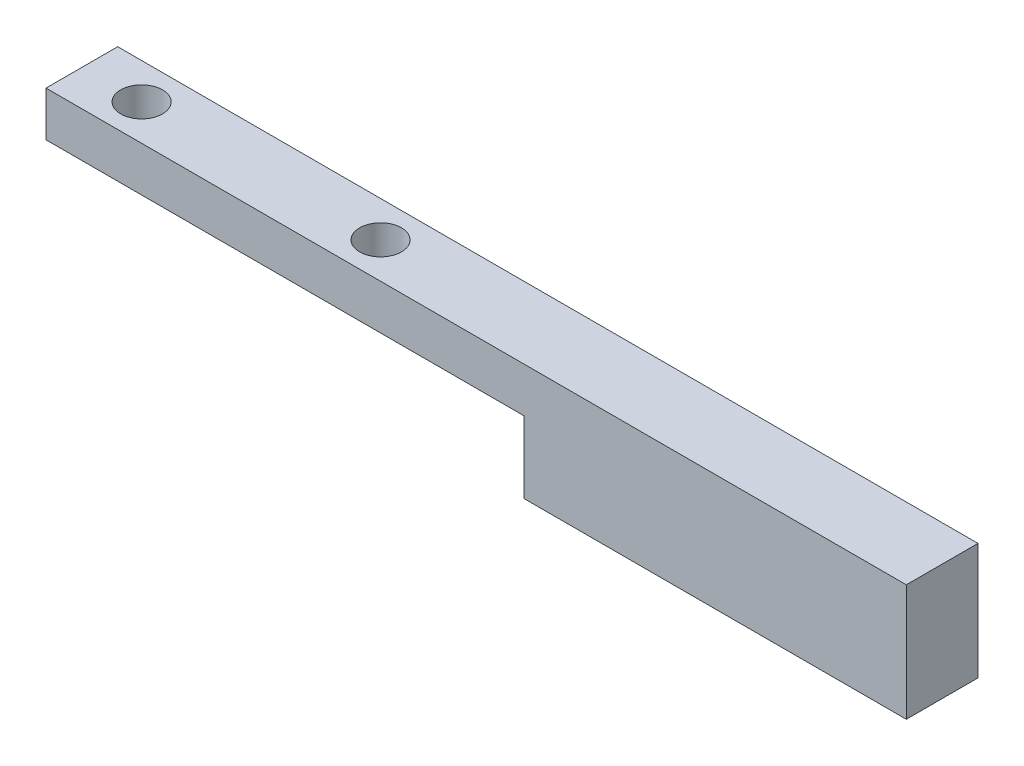
ISO-10303-21;
HEADER;
FILE_DESCRIPTION(('STEP AP214'),'2;1');
FILE_NAME('part.step','',(''),(''),'','','');
FILE_SCHEMA(('AUTOMOTIVE_DESIGN { 1 0 10303 214 1 1 1 1 }'));
ENDSEC;
DATA;
#1=APPLICATION_CONTEXT('core data for automotive mechanical design processes');
#2=APPLICATION_PROTOCOL_DEFINITION('international standard','automotive_design',2000,#1);
#3=PRODUCT_CONTEXT('',#1,'mechanical');
#4=PRODUCT('Part','Part','',(#3));
#5=PRODUCT_RELATED_PRODUCT_CATEGORY('part','',(#4));
#6=PRODUCT_DEFINITION_FORMATION('','',#4);
#7=PRODUCT_DEFINITION_CONTEXT('part definition',#1,'design');
#8=PRODUCT_DEFINITION('design','',#6,#7);
#9=PRODUCT_DEFINITION_SHAPE('','',#8);
#10=(LENGTH_UNIT() NAMED_UNIT(*) SI_UNIT(.MILLI.,.METRE.));
#11=(NAMED_UNIT(*) PLANE_ANGLE_UNIT() SI_UNIT($,.RADIAN.));
#12=(NAMED_UNIT(*) SI_UNIT($,.STERADIAN.) SOLID_ANGLE_UNIT());
#13=UNCERTAINTY_MEASURE_WITH_UNIT(LENGTH_MEASURE(1.E-05),#10,'distance_accuracy_value','');
#14=(GEOMETRIC_REPRESENTATION_CONTEXT(3) GLOBAL_UNCERTAINTY_ASSIGNED_CONTEXT((#13)) GLOBAL_UNIT_ASSIGNED_CONTEXT((#10,
#11,#12)) REPRESENTATION_CONTEXT('',''));
#15=CARTESIAN_POINT('',(0.,0.,0.));
#16=DIRECTION('',(0.,0.,1.));
#17=DIRECTION('',(1.,0.,0.));
#18=AXIS2_PLACEMENT_3D('',#15,#16,#17);
#19=CARTESIAN_POINT('',(0.,3.75,0.));
#20=DIRECTION('',(0.,1.,0.));
#21=DIRECTION('',(0.,0.,1.));
#22=AXIS2_PLACEMENT_3D('',#19,#20,#21);
#23=PLANE('',#22);
#24=CARTESIAN_POINT('',(-15.,3.75,0.));
#25=DIRECTION('',(0.,1.,0.));
#26=DIRECTION('',(0.,0.,1.));
#27=AXIS2_PLACEMENT_3D('',#24,#25,#26);
#28=CIRCLE('',#27,1.75);
#29=CARTESIAN_POINT('',(-15.,3.75,1.75));
#30=VERTEX_POINT('',#29);
#31=EDGE_CURVE('E102',#30,#30,#28,.T.);
#32=ORIENTED_EDGE('',*,*,#31,.F.);
#33=EDGE_LOOP('',(#32));
#34=FACE_BOUND('',#33,.T.);
#35=DIRECTION('',(1.,0.,0.));
#36=VECTOR('',#35,1.);
#37=CARTESIAN_POINT('',(-20.,3.75,3.));
#38=LINE('',#37,#36);
#39=CARTESIAN_POINT('',(-20.,3.75,3.));
#40=VERTEX_POINT('',#39);
#41=CARTESIAN_POINT('',(52.,3.75,3.));
#42=VERTEX_POINT('',#41);
#43=EDGE_CURVE('E147',#40,#42,#38,.T.);
#44=ORIENTED_EDGE('',*,*,#43,.T.);
#45=DIRECTION('',(0.,0.,1.));
#46=VECTOR('',#45,1.);
#47=CARTESIAN_POINT('',(52.,3.75,3.));
#48=LINE('',#47,#46);
#49=CARTESIAN_POINT('',(52.,3.75,-3.));
#50=VERTEX_POINT('',#49);
#51=EDGE_CURVE('E115',#50,#42,#48,.T.);
#52=ORIENTED_EDGE('',*,*,#51,.F.);
#53=DIRECTION('',(-1.,0.,0.));
#54=VECTOR('',#53,1.);
#55=CARTESIAN_POINT('',(-20.,3.75,-3.));
#56=LINE('',#55,#54);
#57=CARTESIAN_POINT('',(-20.,3.75,-3.));
#58=VERTEX_POINT('',#57);
#59=EDGE_CURVE('E90',#50,#58,#56,.T.);
#60=ORIENTED_EDGE('',*,*,#59,.T.);
#61=DIRECTION('',(0.,0.,1.));
#62=VECTOR('',#61,1.);
#63=CARTESIAN_POINT('',(-20.,3.75,-3.));
#64=LINE('',#63,#62);
#65=EDGE_CURVE('E61',#58,#40,#64,.T.);
#66=ORIENTED_EDGE('',*,*,#65,.T.);
#67=EDGE_LOOP('',(#44,#52,#60,#66));
#68=FACE_BOUND('',#67,.T.);
#69=CARTESIAN_POINT('',(5.,3.75,0.));
#70=DIRECTION('',(0.,1.,0.));
#71=DIRECTION('',(0.,0.,1.));
#72=AXIS2_PLACEMENT_3D('',#69,#70,#71);
#73=CIRCLE('',#72,1.75);
#74=CARTESIAN_POINT('',(5.,3.75,1.75));
#75=VERTEX_POINT('',#74);
#76=EDGE_CURVE('E129',#75,#75,#73,.T.);
#77=ORIENTED_EDGE('',*,*,#76,.F.);
#78=EDGE_LOOP('',(#77));
#79=FACE_BOUND('',#78,.T.);
#80=ADVANCED_FACE('F43',(#34,#68,#79),#23,.T.);
#81=CARTESIAN_POINT('',(0.,0.,0.));
#82=DIRECTION('',(0.,1.,0.));
#83=DIRECTION('',(0.,0.,1.));
#84=AXIS2_PLACEMENT_3D('',#81,#82,#83);
#85=PLANE('',#84);
#86=DIRECTION('',(0.,0.,-1.));
#87=VECTOR('',#86,1.);
#88=CARTESIAN_POINT('',(20.,0.,-3.));
#89=LINE('',#88,#87);
#90=CARTESIAN_POINT('',(20.,0.,3.));
#91=VERTEX_POINT('',#90);
#92=CARTESIAN_POINT('',(20.,0.,-3.));
#93=VERTEX_POINT('',#92);
#94=EDGE_CURVE('E94',#91,#93,#89,.T.);
#95=ORIENTED_EDGE('',*,*,#94,.F.);
#96=DIRECTION('',(1.,0.,0.));
#97=VECTOR('',#96,1.);
#98=CARTESIAN_POINT('',(-20.,0.,3.));
#99=LINE('',#98,#97);
#100=CARTESIAN_POINT('',(-20.,0.,3.));
#101=VERTEX_POINT('',#100);
#102=EDGE_CURVE('E79',#101,#91,#99,.T.);
#103=ORIENTED_EDGE('',*,*,#102,.F.);
#104=DIRECTION('',(0.,0.,1.));
#105=VECTOR('',#104,1.);
#106=CARTESIAN_POINT('',(-20.,0.,-3.));
#107=LINE('',#106,#105);
#108=CARTESIAN_POINT('',(-20.,0.,-3.));
#109=VERTEX_POINT('',#108);
#110=EDGE_CURVE('E73',#109,#101,#107,.T.);
#111=ORIENTED_EDGE('',*,*,#110,.F.);
#112=DIRECTION('',(-1.,0.,0.));
#113=VECTOR('',#112,1.);
#114=CARTESIAN_POINT('',(-20.,0.,-3.));
#115=LINE('',#114,#113);
#116=EDGE_CURVE('E97',#93,#109,#115,.T.);
#117=ORIENTED_EDGE('',*,*,#116,.F.);
#118=EDGE_LOOP('',(#95,#103,#111,#117));
#119=FACE_BOUND('',#118,.T.);
#120=CARTESIAN_POINT('',(-15.,0.,0.));
#121=DIRECTION('',(0.,1.,0.));
#122=DIRECTION('',(0.,0.,1.));
#123=AXIS2_PLACEMENT_3D('',#120,#121,#122);
#124=CIRCLE('',#123,1.75);
#125=CARTESIAN_POINT('',(-15.,0.,1.75));
#126=VERTEX_POINT('',#125);
#127=EDGE_CURVE('E133',#126,#126,#124,.T.);
#128=ORIENTED_EDGE('',*,*,#127,.T.);
#129=EDGE_LOOP('',(#128));
#130=FACE_BOUND('',#129,.T.);
#131=CARTESIAN_POINT('',(5.,0.,0.));
#132=DIRECTION('',(0.,1.,0.));
#133=DIRECTION('',(0.,0.,1.));
#134=AXIS2_PLACEMENT_3D('',#131,#132,#133);
#135=CIRCLE('',#134,1.75);
#136=CARTESIAN_POINT('',(5.,0.,1.75));
#137=VERTEX_POINT('',#136);
#138=EDGE_CURVE('E128',#137,#137,#135,.T.);
#139=ORIENTED_EDGE('',*,*,#138,.T.);
#140=EDGE_LOOP('',(#139));
#141=FACE_BOUND('',#140,.T.);
#142=ADVANCED_FACE('F95',(#119,#130,#141),#85,.F.);
#143=CARTESIAN_POINT('',(-20.,3.75,-3.));
#144=DIRECTION('',(0.,0.,1.));
#145=DIRECTION('',(1.,0.,0.));
#146=AXIS2_PLACEMENT_3D('',#143,#144,#145);
#147=PLANE('',#146);
#148=ORIENTED_EDGE('',*,*,#116,.T.);
#149=DIRECTION('',(0.,-1.,0.));
#150=VECTOR('',#149,1.);
#151=CARTESIAN_POINT('',(-20.,3.75,-3.));
#152=LINE('',#151,#150);
#153=EDGE_CURVE('E11',#58,#109,#152,.T.);
#154=ORIENTED_EDGE('',*,*,#153,.F.);
#155=ORIENTED_EDGE('',*,*,#59,.F.);
#156=DIRECTION('',(0.,1.,0.));
#157=VECTOR('',#156,1.);
#158=CARTESIAN_POINT('',(52.,-6.00000000000001,-3.));
#159=LINE('',#158,#157);
#160=CARTESIAN_POINT('',(52.,-6.00000000000001,-3.));
#161=VERTEX_POINT('',#160);
#162=EDGE_CURVE('E154',#161,#50,#159,.T.);
#163=ORIENTED_EDGE('',*,*,#162,.F.);
#164=DIRECTION('',(-1.,0.,0.));
#165=VECTOR('',#164,1.);
#166=CARTESIAN_POINT('',(52.,-6.00000000000001,-3.));
#167=LINE('',#166,#165);
#168=CARTESIAN_POINT('',(20.,-6.00000000000001,-3.));
#169=VERTEX_POINT('',#168);
#170=EDGE_CURVE('E121',#161,#169,#167,.T.);
#171=ORIENTED_EDGE('',*,*,#170,.T.);
#172=DIRECTION('',(0.,1.,0.));
#173=VECTOR('',#172,1.);
#174=CARTESIAN_POINT('',(20.,-6.00000000000001,-3.));
#175=LINE('',#174,#173);
#176=EDGE_CURVE('E112',#169,#93,#175,.T.);
#177=ORIENTED_EDGE('',*,*,#176,.T.);
#178=EDGE_LOOP('',(#148,#154,#155,#163,#171,#177));
#179=FACE_BOUND('',#178,.T.);
#180=ADVANCED_FACE('F45',(#179),#147,.F.);
#181=CARTESIAN_POINT('',(-20.,3.75,-3.));
#182=DIRECTION('',(1.,0.,0.));
#183=DIRECTION('',(0.,0.,-1.));
#184=AXIS2_PLACEMENT_3D('',#181,#182,#183);
#185=PLANE('',#184);
#186=ORIENTED_EDGE('',*,*,#110,.T.);
#187=DIRECTION('',(0.,-1.,0.));
#188=VECTOR('',#187,1.);
#189=CARTESIAN_POINT('',(-20.,3.75,3.));
#190=LINE('',#189,#188);
#191=EDGE_CURVE('E53',#40,#101,#190,.T.);
#192=ORIENTED_EDGE('',*,*,#191,.F.);
#193=ORIENTED_EDGE('',*,*,#65,.F.);
#194=ORIENTED_EDGE('',*,*,#153,.T.);
#195=EDGE_LOOP('',(#186,#192,#193,#194));
#196=FACE_BOUND('',#195,.T.);
#197=ADVANCED_FACE('F206',(#196),#185,.F.);
#198=CARTESIAN_POINT('',(-20.,3.75,3.));
#199=DIRECTION('',(0.,0.,-1.));
#200=DIRECTION('',(-1.,0.,0.));
#201=AXIS2_PLACEMENT_3D('',#198,#199,#200);
#202=PLANE('',#201);
#203=ORIENTED_EDGE('',*,*,#102,.T.);
#204=DIRECTION('',(0.,-1.,0.));
#205=VECTOR('',#204,1.);
#206=CARTESIAN_POINT('',(20.,-6.00000000000001,3.));
#207=LINE('',#206,#205);
#208=CARTESIAN_POINT('',(20.,-6.00000000000001,3.));
#209=VERTEX_POINT('',#208);
#210=EDGE_CURVE('E85',#91,#209,#207,.T.);
#211=ORIENTED_EDGE('',*,*,#210,.T.);
#212=DIRECTION('',(-1.,0.,0.));
#213=VECTOR('',#212,1.);
#214=CARTESIAN_POINT('',(52.,-6.00000000000001,3.));
#215=LINE('',#214,#213);
#216=CARTESIAN_POINT('',(52.,-6.00000000000001,3.));
#217=VERTEX_POINT('',#216);
#218=EDGE_CURVE('E125',#217,#209,#215,.T.);
#219=ORIENTED_EDGE('',*,*,#218,.F.);
#220=DIRECTION('',(0.,-1.,0.));
#221=VECTOR('',#220,1.);
#222=CARTESIAN_POINT('',(52.,-6.00000000000001,3.));
#223=LINE('',#222,#221);
#224=EDGE_CURVE('E120',#42,#217,#223,.T.);
#225=ORIENTED_EDGE('',*,*,#224,.F.);
#226=ORIENTED_EDGE('',*,*,#43,.F.);
#227=ORIENTED_EDGE('',*,*,#191,.T.);
#228=EDGE_LOOP('',(#203,#211,#219,#225,#226,#227));
#229=FACE_BOUND('',#228,.T.);
#230=ADVANCED_FACE('F81',(#229),#202,.F.);
#231=CARTESIAN_POINT('',(-15.,3.75,0.));
#232=DIRECTION('',(0.,-1.,0.));
#233=DIRECTION('',(0.,0.,-1.));
#234=AXIS2_PLACEMENT_3D('',#231,#232,#233);
#235=CYLINDRICAL_SURFACE('',#234,1.75);
#236=ORIENTED_EDGE('',*,*,#31,.T.);
#237=EDGE_LOOP('',(#236));
#238=FACE_BOUND('',#237,.T.);
#239=ORIENTED_EDGE('',*,*,#127,.F.);
#240=EDGE_LOOP('',(#239));
#241=FACE_BOUND('',#240,.T.);
#242=ADVANCED_FACE('F197',(#238,#241),#235,.F.);
#243=CARTESIAN_POINT('',(5.,3.75,0.));
#244=DIRECTION('',(0.,-1.,0.));
#245=DIRECTION('',(0.,0.,-1.));
#246=AXIS2_PLACEMENT_3D('',#243,#244,#245);
#247=CYLINDRICAL_SURFACE('',#246,1.75);
#248=ORIENTED_EDGE('',*,*,#76,.T.);
#249=EDGE_LOOP('',(#248));
#250=FACE_BOUND('',#249,.T.);
#251=ORIENTED_EDGE('',*,*,#138,.F.);
#252=EDGE_LOOP('',(#251));
#253=FACE_BOUND('',#252,.T.);
#254=ADVANCED_FACE('F194',(#250,#253),#247,.F.);
#255=CARTESIAN_POINT('',(52.,-6.00000000000001,3.));
#256=DIRECTION('',(0.,1.,0.));
#257=DIRECTION('',(0.,0.,1.));
#258=AXIS2_PLACEMENT_3D('',#255,#256,#257);
#259=PLANE('',#258);
#260=DIRECTION('',(0.,0.,-1.));
#261=VECTOR('',#260,1.);
#262=CARTESIAN_POINT('',(20.,-6.00000000000001,3.));
#263=LINE('',#262,#261);
#264=EDGE_CURVE('E106',#209,#169,#263,.T.);
#265=ORIENTED_EDGE('',*,*,#264,.T.);
#266=ORIENTED_EDGE('',*,*,#170,.F.);
#267=DIRECTION('',(0.,0.,-1.));
#268=VECTOR('',#267,1.);
#269=CARTESIAN_POINT('',(52.,-6.00000000000001,3.));
#270=LINE('',#269,#268);
#271=EDGE_CURVE('E157',#217,#161,#270,.T.);
#272=ORIENTED_EDGE('',*,*,#271,.F.);
#273=ORIENTED_EDGE('',*,*,#218,.T.);
#274=EDGE_LOOP('',(#265,#266,#272,#273));
#275=FACE_BOUND('',#274,.T.);
#276=ADVANCED_FACE('F177',(#275),#259,.F.);
#277=CARTESIAN_POINT('',(52.,0.,0.));
#278=DIRECTION('',(-1.,0.,0.));
#279=DIRECTION('',(0.,0.,1.));
#280=AXIS2_PLACEMENT_3D('',#277,#278,#279);
#281=PLANE('',#280);
#282=ORIENTED_EDGE('',*,*,#224,.T.);
#283=ORIENTED_EDGE('',*,*,#271,.T.);
#284=ORIENTED_EDGE('',*,*,#162,.T.);
#285=ORIENTED_EDGE('',*,*,#51,.T.);
#286=EDGE_LOOP('',(#282,#283,#284,#285));
#287=FACE_BOUND('',#286,.T.);
#288=ADVANCED_FACE('F171',(#287),#281,.F.);
#289=CARTESIAN_POINT('',(20.,0.,0.));
#290=DIRECTION('',(-1.,0.,0.));
#291=DIRECTION('',(0.,0.,1.));
#292=AXIS2_PLACEMENT_3D('',#289,#290,#291);
#293=PLANE('',#292);
#294=ORIENTED_EDGE('',*,*,#210,.F.);
#295=ORIENTED_EDGE('',*,*,#94,.T.);
#296=ORIENTED_EDGE('',*,*,#176,.F.);
#297=ORIENTED_EDGE('',*,*,#264,.F.);
#298=EDGE_LOOP('',(#294,#295,#296,#297));
#299=FACE_BOUND('',#298,.T.);
#300=ADVANCED_FACE('F104',(#299),#293,.T.);
#301=CLOSED_SHELL('',(#80,#142,#180,#197,#230,#242,#254,#276,#288,#300));
#302=MANIFOLD_SOLID_BREP('B2',#301);
#303=ADVANCED_BREP_SHAPE_REPRESENTATION('',(#18,#302),#14);
#304=SHAPE_DEFINITION_REPRESENTATION(#9,#303);
ENDSEC;
END-ISO-10303-21;
